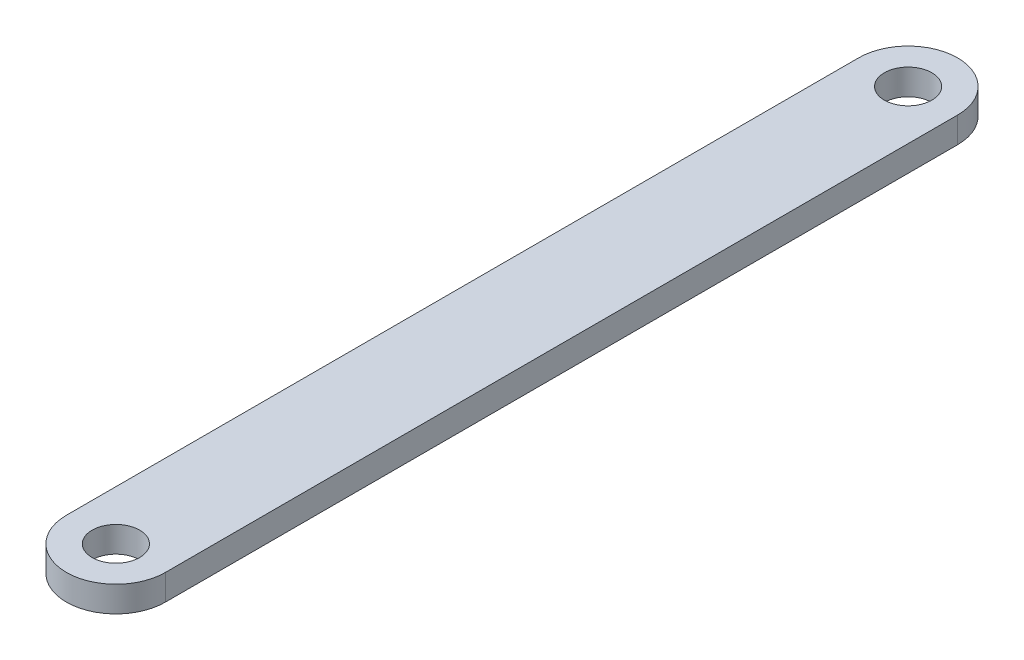
ISO-10303-21;
HEADER;
FILE_DESCRIPTION(('STEP AP214'),'2;1');
FILE_NAME('part.step','',(''),(''),'','','');
FILE_SCHEMA(('AUTOMOTIVE_DESIGN { 1 0 10303 214 1 1 1 1 }'));
ENDSEC;
DATA;
#1=APPLICATION_CONTEXT('core data for automotive mechanical design processes');
#2=APPLICATION_PROTOCOL_DEFINITION('international standard','automotive_design',2000,#1);
#3=PRODUCT_CONTEXT('',#1,'mechanical');
#4=PRODUCT('Part','Part','',(#3));
#5=PRODUCT_RELATED_PRODUCT_CATEGORY('part','',(#4));
#6=PRODUCT_DEFINITION_FORMATION('','',#4);
#7=PRODUCT_DEFINITION_CONTEXT('part definition',#1,'design');
#8=PRODUCT_DEFINITION('design','',#6,#7);
#9=PRODUCT_DEFINITION_SHAPE('','',#8);
#10=(LENGTH_UNIT() NAMED_UNIT(*) SI_UNIT(.MILLI.,.METRE.));
#11=(NAMED_UNIT(*) PLANE_ANGLE_UNIT() SI_UNIT($,.RADIAN.));
#12=(NAMED_UNIT(*) SI_UNIT($,.STERADIAN.) SOLID_ANGLE_UNIT());
#13=UNCERTAINTY_MEASURE_WITH_UNIT(LENGTH_MEASURE(1.E-05),#10,'distance_accuracy_value','');
#14=(GEOMETRIC_REPRESENTATION_CONTEXT(3) GLOBAL_UNCERTAINTY_ASSIGNED_CONTEXT((#13)) GLOBAL_UNIT_ASSIGNED_CONTEXT((#10,
#11,#12)) REPRESENTATION_CONTEXT('',''));
#15=CARTESIAN_POINT('',(0.,0.,0.));
#16=DIRECTION('',(0.,0.,1.));
#17=DIRECTION('',(1.,0.,0.));
#18=AXIS2_PLACEMENT_3D('',#15,#16,#17);
#19=CARTESIAN_POINT('',(0.,3.25,-100.));
#20=DIRECTION('',(0.,1.,0.));
#21=DIRECTION('',(0.,0.,1.));
#22=AXIS2_PLACEMENT_3D('',#19,#20,#21);
#23=PLANE('',#22);
#24=CARTESIAN_POINT('',(0.,3.25,-100.));
#25=DIRECTION('',(0.,1.,0.));
#26=DIRECTION('',(0.,0.,1.));
#27=AXIS2_PLACEMENT_3D('',#24,#25,#26);
#28=CIRCLE('',#27,6.);
#29=CARTESIAN_POINT('',(0.,3.25,-106.));
#30=VERTEX_POINT('',#29);
#31=EDGE_CURVE('E106',#30,#30,#28,.T.);
#32=ORIENTED_EDGE('',*,*,#31,.F.);
#33=EDGE_LOOP('',(#32));
#34=FACE_BOUND('',#33,.T.);
#35=CARTESIAN_POINT('',(0.,3.25,-100.));
#36=DIRECTION('',(0.,1.,0.));
#37=DIRECTION('',(0.,0.,1.));
#38=AXIS2_PLACEMENT_3D('',#35,#36,#37);
#39=CIRCLE('',#38,12.5);
#40=CARTESIAN_POINT('',(12.5,3.25,-100.));
#41=VERTEX_POINT('',#40);
#42=CARTESIAN_POINT('',(-12.5,3.25,-100.));
#43=VERTEX_POINT('',#42);
#44=EDGE_CURVE('E91',#41,#43,#39,.T.);
#45=ORIENTED_EDGE('',*,*,#44,.T.);
#46=DIRECTION('',(0.,0.,1.));
#47=VECTOR('',#46,1.);
#48=CARTESIAN_POINT('',(-12.5,3.25,-100.));
#49=LINE('',#48,#47);
#50=CARTESIAN_POINT('',(-12.5,3.25,100.));
#51=VERTEX_POINT('',#50);
#52=EDGE_CURVE('E86',#43,#51,#49,.T.);
#53=ORIENTED_EDGE('',*,*,#52,.T.);
#54=CARTESIAN_POINT('',(0.,3.25,100.));
#55=DIRECTION('',(0.,1.,0.));
#56=DIRECTION('',(0.,0.,-1.));
#57=AXIS2_PLACEMENT_3D('',#54,#55,#56);
#58=CIRCLE('',#57,12.5);
#59=CARTESIAN_POINT('',(12.5,3.25,100.));
#60=VERTEX_POINT('',#59);
#61=EDGE_CURVE('E89',#51,#60,#58,.T.);
#62=ORIENTED_EDGE('',*,*,#61,.T.);
#63=DIRECTION('',(0.,0.,-1.));
#64=VECTOR('',#63,1.);
#65=CARTESIAN_POINT('',(12.5,3.25,-100.));
#66=LINE('',#65,#64);
#67=EDGE_CURVE('E56',#60,#41,#66,.T.);
#68=ORIENTED_EDGE('',*,*,#67,.T.);
#69=EDGE_LOOP('',(#45,#53,#62,#68));
#70=FACE_BOUND('',#69,.T.);
#71=CARTESIAN_POINT('',(0.,3.25,100.));
#72=DIRECTION('',(0.,1.,0.));
#73=DIRECTION('',(0.,0.,-1.));
#74=AXIS2_PLACEMENT_3D('',#71,#72,#73);
#75=CIRCLE('',#74,6.);
#76=CARTESIAN_POINT('',(0.,3.25,94.));
#77=VERTEX_POINT('',#76);
#78=EDGE_CURVE('E121',#77,#77,#75,.T.);
#79=ORIENTED_EDGE('',*,*,#78,.F.);
#80=EDGE_LOOP('',(#79));
#81=FACE_BOUND('',#80,.T.);
#82=ADVANCED_FACE('F39',(#34,#70,#81),#23,.T.);
#83=CARTESIAN_POINT('',(0.,-3.25,-100.));
#84=DIRECTION('',(0.,1.,0.));
#85=DIRECTION('',(0.,0.,1.));
#86=AXIS2_PLACEMENT_3D('',#83,#84,#85);
#87=PLANE('',#86);
#88=CARTESIAN_POINT('',(0.,-3.25,-100.));
#89=DIRECTION('',(0.,1.,0.));
#90=DIRECTION('',(0.,0.,1.));
#91=AXIS2_PLACEMENT_3D('',#88,#89,#90);
#92=CIRCLE('',#91,12.5);
#93=CARTESIAN_POINT('',(12.5,-3.25,-100.));
#94=VERTEX_POINT('',#93);
#95=CARTESIAN_POINT('',(-12.5,-3.25,-100.));
#96=VERTEX_POINT('',#95);
#97=EDGE_CURVE('E103',#94,#96,#92,.T.);
#98=ORIENTED_EDGE('',*,*,#97,.F.);
#99=DIRECTION('',(0.,0.,-1.));
#100=VECTOR('',#99,1.);
#101=CARTESIAN_POINT('',(12.5,-3.25,-100.));
#102=LINE('',#101,#100);
#103=CARTESIAN_POINT('',(12.5,-3.25,100.));
#104=VERTEX_POINT('',#103);
#105=EDGE_CURVE('E79',#104,#94,#102,.T.);
#106=ORIENTED_EDGE('',*,*,#105,.F.);
#107=CARTESIAN_POINT('',(0.,-3.25,100.));
#108=DIRECTION('',(0.,1.,0.));
#109=DIRECTION('',(0.,0.,-1.));
#110=AXIS2_PLACEMENT_3D('',#107,#108,#109);
#111=CIRCLE('',#110,12.5);
#112=CARTESIAN_POINT('',(-12.5,-3.25,100.));
#113=VERTEX_POINT('',#112);
#114=EDGE_CURVE('E73',#113,#104,#111,.T.);
#115=ORIENTED_EDGE('',*,*,#114,.F.);
#116=DIRECTION('',(0.,0.,1.));
#117=VECTOR('',#116,1.);
#118=CARTESIAN_POINT('',(-12.5,-3.25,-100.));
#119=LINE('',#118,#117);
#120=EDGE_CURVE('E95',#96,#113,#119,.T.);
#121=ORIENTED_EDGE('',*,*,#120,.F.);
#122=EDGE_LOOP('',(#98,#106,#115,#121));
#123=FACE_BOUND('',#122,.T.);
#124=CARTESIAN_POINT('',(0.,-3.25,-100.));
#125=DIRECTION('',(0.,1.,0.));
#126=DIRECTION('',(0.,0.,1.));
#127=AXIS2_PLACEMENT_3D('',#124,#125,#126);
#128=CIRCLE('',#127,6.);
#129=CARTESIAN_POINT('',(0.,-3.25,-106.));
#130=VERTEX_POINT('',#129);
#131=EDGE_CURVE('E118',#130,#130,#128,.T.);
#132=ORIENTED_EDGE('',*,*,#131,.T.);
#133=EDGE_LOOP('',(#132));
#134=FACE_BOUND('',#133,.T.);
#135=CARTESIAN_POINT('',(0.,-3.25,100.));
#136=DIRECTION('',(0.,1.,0.));
#137=DIRECTION('',(0.,0.,-1.));
#138=AXIS2_PLACEMENT_3D('',#135,#136,#137);
#139=CIRCLE('',#138,6.);
#140=CARTESIAN_POINT('',(0.,-3.25,94.));
#141=VERTEX_POINT('',#140);
#142=EDGE_CURVE('E124',#141,#141,#139,.T.);
#143=ORIENTED_EDGE('',*,*,#142,.T.);
#144=EDGE_LOOP('',(#143));
#145=FACE_BOUND('',#144,.T.);
#146=ADVANCED_FACE('F114',(#123,#134,#145),#87,.F.);
#147=CARTESIAN_POINT('',(0.,3.25,-100.));
#148=DIRECTION('',(0.,-1.,0.));
#149=DIRECTION('',(0.,0.,-1.));
#150=AXIS2_PLACEMENT_3D('',#147,#148,#149);
#151=CYLINDRICAL_SURFACE('',#150,12.5);
#152=ORIENTED_EDGE('',*,*,#97,.T.);
#153=DIRECTION('',(0.,-1.,0.));
#154=VECTOR('',#153,1.);
#155=CARTESIAN_POINT('',(-12.5,3.25,-100.));
#156=LINE('',#155,#154);
#157=EDGE_CURVE('E11',#43,#96,#156,.T.);
#158=ORIENTED_EDGE('',*,*,#157,.F.);
#159=ORIENTED_EDGE('',*,*,#44,.F.);
#160=DIRECTION('',(0.,-1.,0.));
#161=VECTOR('',#160,1.);
#162=CARTESIAN_POINT('',(12.5,3.25,-100.));
#163=LINE('',#162,#161);
#164=EDGE_CURVE('E99',#41,#94,#163,.T.);
#165=ORIENTED_EDGE('',*,*,#164,.T.);
#166=EDGE_LOOP('',(#152,#158,#159,#165));
#167=FACE_BOUND('',#166,.T.);
#168=ADVANCED_FACE('F41',(#167),#151,.T.);
#169=CARTESIAN_POINT('',(-12.5,3.25,-100.));
#170=DIRECTION('',(1.,0.,0.));
#171=DIRECTION('',(0.,0.,-1.));
#172=AXIS2_PLACEMENT_3D('',#169,#170,#171);
#173=PLANE('',#172);
#174=ORIENTED_EDGE('',*,*,#120,.T.);
#175=DIRECTION('',(0.,-1.,0.));
#176=VECTOR('',#175,1.);
#177=CARTESIAN_POINT('',(-12.5,3.25,100.));
#178=LINE('',#177,#176);
#179=EDGE_CURVE('E48',#51,#113,#178,.T.);
#180=ORIENTED_EDGE('',*,*,#179,.F.);
#181=ORIENTED_EDGE('',*,*,#52,.F.);
#182=ORIENTED_EDGE('',*,*,#157,.T.);
#183=EDGE_LOOP('',(#174,#180,#181,#182));
#184=FACE_BOUND('',#183,.T.);
#185=ADVANCED_FACE('F94',(#184),#173,.F.);
#186=CARTESIAN_POINT('',(0.,3.25,100.));
#187=DIRECTION('',(0.,-1.,0.));
#188=DIRECTION('',(0.,0.,-1.));
#189=AXIS2_PLACEMENT_3D('',#186,#187,#188);
#190=CYLINDRICAL_SURFACE('',#189,12.5);
#191=ORIENTED_EDGE('',*,*,#114,.T.);
#192=DIRECTION('',(0.,-1.,0.));
#193=VECTOR('',#192,1.);
#194=CARTESIAN_POINT('',(12.5,3.25,100.));
#195=LINE('',#194,#193);
#196=EDGE_CURVE('E96',#60,#104,#195,.T.);
#197=ORIENTED_EDGE('',*,*,#196,.F.);
#198=ORIENTED_EDGE('',*,*,#61,.F.);
#199=ORIENTED_EDGE('',*,*,#179,.T.);
#200=EDGE_LOOP('',(#191,#197,#198,#199));
#201=FACE_BOUND('',#200,.T.);
#202=ADVANCED_FACE('F97',(#201),#190,.T.);
#203=CARTESIAN_POINT('',(12.5,3.25,-100.));
#204=DIRECTION('',(-1.,0.,0.));
#205=DIRECTION('',(0.,0.,1.));
#206=AXIS2_PLACEMENT_3D('',#203,#204,#205);
#207=PLANE('',#206);
#208=ORIENTED_EDGE('',*,*,#105,.T.);
#209=ORIENTED_EDGE('',*,*,#164,.F.);
#210=ORIENTED_EDGE('',*,*,#67,.F.);
#211=ORIENTED_EDGE('',*,*,#196,.T.);
#212=EDGE_LOOP('',(#208,#209,#210,#211));
#213=FACE_BOUND('',#212,.T.);
#214=ADVANCED_FACE('F111',(#213),#207,.F.);
#215=CARTESIAN_POINT('',(0.,3.25,-100.));
#216=DIRECTION('',(0.,-1.,0.));
#217=DIRECTION('',(0.,0.,-1.));
#218=AXIS2_PLACEMENT_3D('',#215,#216,#217);
#219=CYLINDRICAL_SURFACE('',#218,6.);
#220=CARTESIAN_POINT('',(0.,3.25,-106.));
#221=CARTESIAN_POINT('',(0.,3.18229166666667,-106.));
#222=CARTESIAN_POINT('',(0.,3.11458333333333,-106.));
#223=CARTESIAN_POINT('',(0.,2.97916666666667,-106.));
#224=CARTESIAN_POINT('',(0.,2.91145833333333,-106.));
#225=CARTESIAN_POINT('',(0.,2.77604166666667,-106.));
#226=CARTESIAN_POINT('',(0.,2.70833333333333,-106.));
#227=CARTESIAN_POINT('',(0.,2.57291666666667,-106.));
#228=CARTESIAN_POINT('',(0.,2.50520833333333,-106.));
#229=CARTESIAN_POINT('',(0.,2.36979166666667,-106.));
#230=CARTESIAN_POINT('',(0.,2.30208333333333,-106.));
#231=CARTESIAN_POINT('',(0.,2.16666666666667,-106.));
#232=CARTESIAN_POINT('',(0.,2.09895833333333,-106.));
#233=CARTESIAN_POINT('',(0.,1.96354166666667,-106.));
#234=CARTESIAN_POINT('',(0.,1.89583333333333,-106.));
#235=CARTESIAN_POINT('',(0.,1.76041666666667,-106.));
#236=CARTESIAN_POINT('',(0.,1.69270833333333,-106.));
#237=CARTESIAN_POINT('',(0.,1.55729166666667,-106.));
#238=CARTESIAN_POINT('',(0.,1.48958333333333,-106.));
#239=CARTESIAN_POINT('',(0.,1.35416666666667,-106.));
#240=CARTESIAN_POINT('',(0.,1.28645833333333,-106.));
#241=CARTESIAN_POINT('',(0.,1.15104166666667,-106.));
#242=CARTESIAN_POINT('',(0.,1.08333333333333,-106.));
#243=CARTESIAN_POINT('',(0.,0.947916666666667,-106.));
#244=CARTESIAN_POINT('',(0.,0.880208333333333,-106.));
#245=CARTESIAN_POINT('',(0.,0.744791666666667,-106.));
#246=CARTESIAN_POINT('',(0.,0.677083333333333,-106.));
#247=CARTESIAN_POINT('',(0.,0.541666666666667,-106.));
#248=CARTESIAN_POINT('',(0.,0.473958333333333,-106.));
#249=CARTESIAN_POINT('',(0.,0.338541666666667,-106.));
#250=CARTESIAN_POINT('',(0.,0.270833333333333,-106.));
#251=CARTESIAN_POINT('',(0.,0.135416666666667,-106.));
#252=CARTESIAN_POINT('',(0.,0.0677083333333334,-106.));
#253=CARTESIAN_POINT('',(0.,-0.0677083333333334,-106.));
#254=CARTESIAN_POINT('',(0.,-0.135416666666667,-106.));
#255=CARTESIAN_POINT('',(0.,-0.270833333333333,-106.));
#256=CARTESIAN_POINT('',(0.,-0.338541666666667,-106.));
#257=CARTESIAN_POINT('',(0.,-0.473958333333333,-106.));
#258=CARTESIAN_POINT('',(0.,-0.541666666666667,-106.));
#259=CARTESIAN_POINT('',(0.,-0.677083333333333,-106.));
#260=CARTESIAN_POINT('',(0.,-0.744791666666666,-106.));
#261=CARTESIAN_POINT('',(0.,-0.880208333333333,-106.));
#262=CARTESIAN_POINT('',(0.,-0.947916666666666,-106.));
#263=CARTESIAN_POINT('',(0.,-1.08333333333333,-106.));
#264=CARTESIAN_POINT('',(0.,-1.15104166666667,-106.));
#265=CARTESIAN_POINT('',(0.,-1.28645833333333,-106.));
#266=CARTESIAN_POINT('',(0.,-1.35416666666667,-106.));
#267=CARTESIAN_POINT('',(0.,-1.48958333333333,-106.));
#268=CARTESIAN_POINT('',(0.,-1.55729166666667,-106.));
#269=CARTESIAN_POINT('',(0.,-1.69270833333333,-106.));
#270=CARTESIAN_POINT('',(0.,-1.76041666666667,-106.));
#271=CARTESIAN_POINT('',(0.,-1.89583333333333,-106.));
#272=CARTESIAN_POINT('',(0.,-1.96354166666667,-106.));
#273=CARTESIAN_POINT('',(0.,-2.09895833333333,-106.));
#274=CARTESIAN_POINT('',(0.,-2.16666666666667,-106.));
#275=CARTESIAN_POINT('',(0.,-2.30208333333333,-106.));
#276=CARTESIAN_POINT('',(0.,-2.36979166666667,-106.));
#277=CARTESIAN_POINT('',(0.,-2.50520833333333,-106.));
#278=CARTESIAN_POINT('',(0.,-2.57291666666667,-106.));
#279=CARTESIAN_POINT('',(0.,-2.70833333333333,-106.));
#280=CARTESIAN_POINT('',(0.,-2.77604166666667,-106.));
#281=CARTESIAN_POINT('',(0.,-2.91145833333333,-106.));
#282=CARTESIAN_POINT('',(0.,-2.97916666666667,-106.));
#283=CARTESIAN_POINT('',(0.,-3.11458333333333,-106.));
#284=CARTESIAN_POINT('',(0.,-3.18229166666667,-106.));
#285=CARTESIAN_POINT('',(0.,-3.25,-106.));
#286=B_SPLINE_CURVE_WITH_KNOTS('',3,(#220,#221,#222,#223,#224,#225,#226,#227,#228,#229,#230,
#231,#232,#233,#234,#235,#236,#237,#238,#239,#240,#241,#242,#243,#244,#245,#246,#247,#248,#249,
#250,#251,#252,#253,#254,#255,#256,#257,#258,#259,#260,#261,#262,#263,#264,#265,#266,#267,#268,
#269,#270,#271,#272,#273,#274,#275,#276,#277,#278,#279,#280,#281,#282,#283,#284,#285),
.UNSPECIFIED.,.F.,.F.,(4,2,2,2,2,2,2,2,2,2,2,2,2,2,2,2,2,2,2,2,2,2,2,2,2,2,2,2,2,2,2,2,4),(0.,
0.203125,0.40625,0.609375,0.8125,1.015625,1.21875,1.421875,1.625,1.828125,2.03125,2.234375,
2.4375,2.640625,2.84375,3.046875,3.25,3.453125,3.65625,3.859375,4.0625,4.265625,4.46875,
4.671875,4.875,5.078125,5.28125,5.484375,5.6875,5.890625,6.09375,6.296875,6.5),.UNSPECIFIED.);
#287=EDGE_CURVE('BSEAM141',#30,#130,#286,.T.);
#288=ORIENTED_EDGE('',*,*,#31,.T.);
#289=ORIENTED_EDGE('',*,*,#131,.F.);
#290=ORIENTED_EDGE('',*,*,#287,.T.);
#291=ORIENTED_EDGE('',*,*,#287,.F.);
#292=EDGE_LOOP('',(#288,#290,#289,#291));
#293=FACE_BOUND('',#292,.T.);
#294=ADVANCED_FACE('F141',(#293),#219,.F.);
#295=CARTESIAN_POINT('',(0.,3.25,100.));
#296=DIRECTION('',(0.,-1.,0.));
#297=DIRECTION('',(0.,0.,-1.));
#298=AXIS2_PLACEMENT_3D('',#295,#296,#297);
#299=CYLINDRICAL_SURFACE('',#298,6.);
#300=CARTESIAN_POINT('',(0.,3.25,94.));
#301=CARTESIAN_POINT('',(0.,3.18229166666667,94.));
#302=CARTESIAN_POINT('',(0.,3.11458333333333,94.));
#303=CARTESIAN_POINT('',(0.,2.97916666666667,94.));
#304=CARTESIAN_POINT('',(0.,2.91145833333333,94.));
#305=CARTESIAN_POINT('',(0.,2.77604166666667,94.));
#306=CARTESIAN_POINT('',(0.,2.70833333333333,94.));
#307=CARTESIAN_POINT('',(0.,2.57291666666667,94.));
#308=CARTESIAN_POINT('',(0.,2.50520833333333,94.));
#309=CARTESIAN_POINT('',(0.,2.36979166666667,94.));
#310=CARTESIAN_POINT('',(0.,2.30208333333333,94.));
#311=CARTESIAN_POINT('',(0.,2.16666666666667,94.));
#312=CARTESIAN_POINT('',(0.,2.09895833333333,94.));
#313=CARTESIAN_POINT('',(0.,1.96354166666667,94.));
#314=CARTESIAN_POINT('',(0.,1.89583333333333,94.));
#315=CARTESIAN_POINT('',(0.,1.76041666666667,94.));
#316=CARTESIAN_POINT('',(0.,1.69270833333333,94.));
#317=CARTESIAN_POINT('',(0.,1.55729166666667,94.));
#318=CARTESIAN_POINT('',(0.,1.48958333333333,94.));
#319=CARTESIAN_POINT('',(0.,1.35416666666667,94.));
#320=CARTESIAN_POINT('',(0.,1.28645833333333,94.));
#321=CARTESIAN_POINT('',(0.,1.15104166666667,94.));
#322=CARTESIAN_POINT('',(0.,1.08333333333333,94.));
#323=CARTESIAN_POINT('',(0.,0.947916666666667,94.));
#324=CARTESIAN_POINT('',(0.,0.880208333333333,94.));
#325=CARTESIAN_POINT('',(0.,0.744791666666667,94.));
#326=CARTESIAN_POINT('',(0.,0.677083333333333,94.));
#327=CARTESIAN_POINT('',(0.,0.541666666666667,94.));
#328=CARTESIAN_POINT('',(0.,0.473958333333333,94.));
#329=CARTESIAN_POINT('',(0.,0.338541666666667,94.));
#330=CARTESIAN_POINT('',(0.,0.270833333333333,94.));
#331=CARTESIAN_POINT('',(0.,0.135416666666667,94.));
#332=CARTESIAN_POINT('',(0.,0.0677083333333334,94.));
#333=CARTESIAN_POINT('',(0.,-0.0677083333333334,94.));
#334=CARTESIAN_POINT('',(0.,-0.135416666666667,94.));
#335=CARTESIAN_POINT('',(0.,-0.270833333333333,94.));
#336=CARTESIAN_POINT('',(0.,-0.338541666666667,94.));
#337=CARTESIAN_POINT('',(0.,-0.473958333333333,94.));
#338=CARTESIAN_POINT('',(0.,-0.541666666666667,94.));
#339=CARTESIAN_POINT('',(0.,-0.677083333333333,94.));
#340=CARTESIAN_POINT('',(0.,-0.744791666666666,94.));
#341=CARTESIAN_POINT('',(0.,-0.880208333333333,94.));
#342=CARTESIAN_POINT('',(0.,-0.947916666666666,94.));
#343=CARTESIAN_POINT('',(0.,-1.08333333333333,94.));
#344=CARTESIAN_POINT('',(0.,-1.15104166666667,94.));
#345=CARTESIAN_POINT('',(0.,-1.28645833333333,94.));
#346=CARTESIAN_POINT('',(0.,-1.35416666666667,94.));
#347=CARTESIAN_POINT('',(0.,-1.48958333333333,94.));
#348=CARTESIAN_POINT('',(0.,-1.55729166666667,94.));
#349=CARTESIAN_POINT('',(0.,-1.69270833333333,94.));
#350=CARTESIAN_POINT('',(0.,-1.76041666666667,94.));
#351=CARTESIAN_POINT('',(0.,-1.89583333333333,94.));
#352=CARTESIAN_POINT('',(0.,-1.96354166666667,94.));
#353=CARTESIAN_POINT('',(0.,-2.09895833333333,94.));
#354=CARTESIAN_POINT('',(0.,-2.16666666666667,94.));
#355=CARTESIAN_POINT('',(0.,-2.30208333333333,94.));
#356=CARTESIAN_POINT('',(0.,-2.36979166666667,94.));
#357=CARTESIAN_POINT('',(0.,-2.50520833333333,94.));
#358=CARTESIAN_POINT('',(0.,-2.57291666666667,94.));
#359=CARTESIAN_POINT('',(0.,-2.70833333333333,94.));
#360=CARTESIAN_POINT('',(0.,-2.77604166666667,94.));
#361=CARTESIAN_POINT('',(0.,-2.91145833333333,94.));
#362=CARTESIAN_POINT('',(0.,-2.97916666666667,94.));
#363=CARTESIAN_POINT('',(0.,-3.11458333333333,94.));
#364=CARTESIAN_POINT('',(0.,-3.18229166666667,94.));
#365=CARTESIAN_POINT('',(0.,-3.25,94.));
#366=B_SPLINE_CURVE_WITH_KNOTS('',3,(#300,#301,#302,#303,#304,#305,#306,#307,#308,#309,#310,
#311,#312,#313,#314,#315,#316,#317,#318,#319,#320,#321,#322,#323,#324,#325,#326,#327,#328,#329,
#330,#331,#332,#333,#334,#335,#336,#337,#338,#339,#340,#341,#342,#343,#344,#345,#346,#347,#348,
#349,#350,#351,#352,#353,#354,#355,#356,#357,#358,#359,#360,#361,#362,#363,#364,#365),
.UNSPECIFIED.,.F.,.F.,(4,2,2,2,2,2,2,2,2,2,2,2,2,2,2,2,2,2,2,2,2,2,2,2,2,2,2,2,2,2,2,2,4),(0.,
0.203125,0.40625,0.609375,0.8125,1.015625,1.21875,1.421875,1.625,1.828125,2.03125,2.234375,
2.4375,2.640625,2.84375,3.046875,3.25,3.453125,3.65625,3.859375,4.0625,4.265625,4.46875,
4.671875,4.875,5.078125,5.28125,5.484375,5.6875,5.890625,6.09375,6.296875,6.5),.UNSPECIFIED.);
#367=EDGE_CURVE('BSEAM130',#77,#141,#366,.T.);
#368=ORIENTED_EDGE('',*,*,#78,.T.);
#369=ORIENTED_EDGE('',*,*,#142,.F.);
#370=ORIENTED_EDGE('',*,*,#367,.T.);
#371=ORIENTED_EDGE('',*,*,#367,.F.);
#372=EDGE_LOOP('',(#368,#370,#369,#371));
#373=FACE_BOUND('',#372,.T.);
#374=ADVANCED_FACE('F130',(#373),#299,.F.);
#375=CLOSED_SHELL('',(#82,#146,#168,#185,#202,#214,#294,#374));
#376=MANIFOLD_SOLID_BREP('B2',#375);
#377=ADVANCED_BREP_SHAPE_REPRESENTATION('',(#18,#376),#14);
#378=SHAPE_DEFINITION_REPRESENTATION(#9,#377);
ENDSEC;
END-ISO-10303-21;
